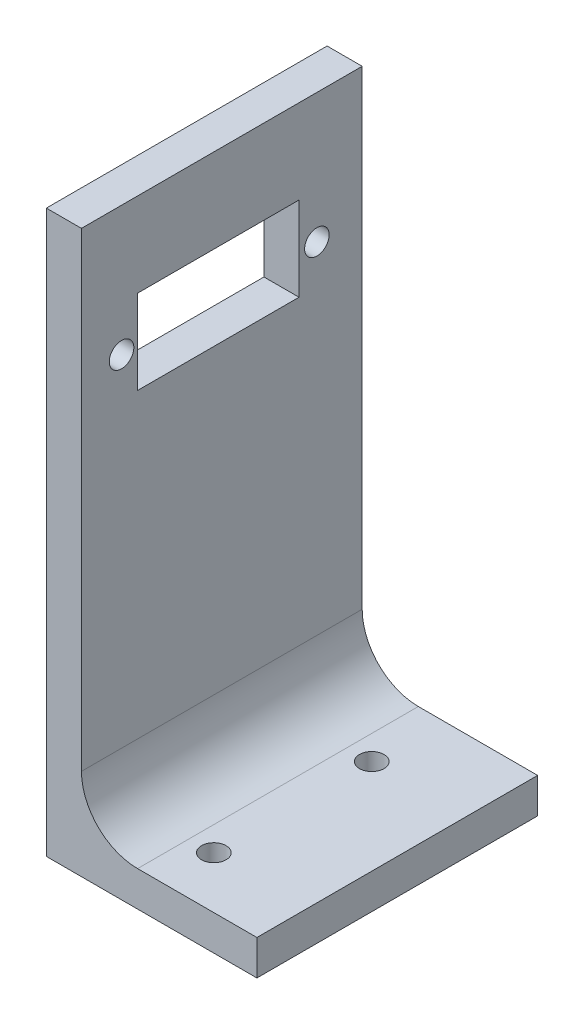
ISO-10303-21;
HEADER;
FILE_DESCRIPTION(('STEP AP214'),'2;1');
FILE_NAME('part.step','',(''),(''),'','','');
FILE_SCHEMA(('AUTOMOTIVE_DESIGN { 1 0 10303 214 1 1 1 1 }'));
ENDSEC;
DATA;
#1=APPLICATION_CONTEXT('core data for automotive mechanical design processes');
#2=APPLICATION_PROTOCOL_DEFINITION('international standard','automotive_design',2000,#1);
#3=PRODUCT_CONTEXT('',#1,'mechanical');
#4=PRODUCT('Part','Part','',(#3));
#5=PRODUCT_RELATED_PRODUCT_CATEGORY('part','',(#4));
#6=PRODUCT_DEFINITION_FORMATION('','',#4);
#7=PRODUCT_DEFINITION_CONTEXT('part definition',#1,'design');
#8=PRODUCT_DEFINITION('design','',#6,#7);
#9=PRODUCT_DEFINITION_SHAPE('','',#8);
#10=(LENGTH_UNIT() NAMED_UNIT(*) SI_UNIT(.MILLI.,.METRE.));
#11=(NAMED_UNIT(*) PLANE_ANGLE_UNIT() SI_UNIT($,.RADIAN.));
#12=(NAMED_UNIT(*) SI_UNIT($,.STERADIAN.) SOLID_ANGLE_UNIT());
#13=UNCERTAINTY_MEASURE_WITH_UNIT(LENGTH_MEASURE(1.E-05),#10,'distance_accuracy_value','');
#14=(GEOMETRIC_REPRESENTATION_CONTEXT(3) GLOBAL_UNCERTAINTY_ASSIGNED_CONTEXT((#13)) GLOBAL_UNIT_ASSIGNED_CONTEXT((#10,
#11,#12)) REPRESENTATION_CONTEXT('',''));
#15=CARTESIAN_POINT('',(0.,0.,0.));
#16=DIRECTION('',(0.,0.,1.));
#17=DIRECTION('',(1.,0.,0.));
#18=AXIS2_PLACEMENT_3D('',#15,#16,#17);
#19=CARTESIAN_POINT('',(0.,-34.9738219895288,40.));
#20=DIRECTION('',(0.,-1.,0.));
#21=DIRECTION('',(0.,0.,-1.));
#22=AXIS2_PLACEMENT_3D('',#19,#20,#21);
#23=PLANE('',#22);
#24=CARTESIAN_POINT('',(-13.5290293124797,-34.9738219895288,32.612904953595));
#25=DIRECTION('',(0.,1.,0.));
#26=DIRECTION('',(0.,0.,1.));
#27=AXIS2_PLACEMENT_3D('',#24,#25,#26);
#28=CIRCLE('',#27,1.74999999999999);
#29=CARTESIAN_POINT('',(-13.5290293124797,-34.9738219895288,34.362904953595));
#30=VERTEX_POINT('',#29);
#31=EDGE_CURVE('E142',#30,#30,#28,.T.);
#32=ORIENTED_EDGE('',*,*,#31,.F.);
#33=EDGE_LOOP('',(#32));
#34=FACE_BOUND('',#33,.T.);
#35=CARTESIAN_POINT('',(-13.5290293124797,-34.9738219895288,10.1107689095841));
#36=DIRECTION('',(0.,1.,0.));
#37=DIRECTION('',(0.,0.,1.));
#38=AXIS2_PLACEMENT_3D('',#35,#36,#37);
#39=CIRCLE('',#38,1.74999999999999);
#40=CARTESIAN_POINT('',(-13.5290293124797,-34.9738219895288,11.8607689095841));
#41=VERTEX_POINT('',#40);
#42=EDGE_CURVE('E150',#41,#41,#39,.T.);
#43=ORIENTED_EDGE('',*,*,#42,.F.);
#44=EDGE_LOOP('',(#43));
#45=FACE_BOUND('',#44,.T.);
#46=DIRECTION('',(-1.,0.,0.));
#47=VECTOR('',#46,1.);
#48=CARTESIAN_POINT('',(0.,-34.9738219895288,0.));
#49=LINE('',#48,#47);
#50=CARTESIAN_POINT('',(0.,-34.9738219895288,0.));
#51=VERTEX_POINT('',#50);
#52=CARTESIAN_POINT('',(-17.,-34.9738219895288,0.));
#53=VERTEX_POINT('',#52);
#54=EDGE_CURVE('E156',#51,#53,#49,.T.);
#55=ORIENTED_EDGE('',*,*,#54,.T.);
#56=DIRECTION('',(0.,0.,-1.));
#57=VECTOR('',#56,1.);
#58=CARTESIAN_POINT('',(-17.,-34.9738219895288,40.));
#59=LINE('',#58,#57);
#60=CARTESIAN_POINT('',(-17.,-34.9738219895288,40.));
#61=VERTEX_POINT('',#60);
#62=EDGE_CURVE('E200',#53,#61,#59,.F.);
#63=ORIENTED_EDGE('',*,*,#62,.T.);
#64=DIRECTION('',(-1.,0.,0.));
#65=VECTOR('',#64,1.);
#66=CARTESIAN_POINT('',(0.,-34.9738219895288,40.));
#67=LINE('',#66,#65);
#68=CARTESIAN_POINT('',(0.,-34.9738219895288,40.));
#69=VERTEX_POINT('',#68);
#70=EDGE_CURVE('E157',#69,#61,#67,.T.);
#71=ORIENTED_EDGE('',*,*,#70,.F.);
#72=DIRECTION('',(0.,0.,-1.));
#73=VECTOR('',#72,1.);
#74=CARTESIAN_POINT('',(0.,-34.9738219895288,40.));
#75=LINE('',#74,#73);
#76=EDGE_CURVE('E171',#69,#51,#75,.T.);
#77=ORIENTED_EDGE('',*,*,#76,.T.);
#78=EDGE_LOOP('',(#55,#63,#71,#77));
#79=FACE_BOUND('',#78,.T.);
#80=ADVANCED_FACE('F33',(#34,#45,#79),#23,.F.);
#81=CARTESIAN_POINT('',(-25.,-34.9738219895288,40.));
#82=DIRECTION('',(-1.,0.,0.));
#83=DIRECTION('',(0.,-1.,0.));
#84=AXIS2_PLACEMENT_3D('',#81,#82,#83);
#85=PLANE('',#84);
#86=CARTESIAN_POINT('',(-25.,21.588594031158,6.45454845479065));
#87=DIRECTION('',(1.,0.,0.));
#88=DIRECTION('',(0.,0.,-1.));
#89=AXIS2_PLACEMENT_3D('',#86,#87,#88);
#90=CIRCLE('',#89,1.74999999999999);
#91=CARTESIAN_POINT('',(-25.,21.588594031158,4.70454845479067));
#92=VERTEX_POINT('',#91);
#93=EDGE_CURVE('E363',#92,#92,#90,.T.);
#94=ORIENTED_EDGE('',*,*,#93,.F.);
#95=EDGE_LOOP('',(#94));
#96=FACE_BOUND('',#95,.T.);
#97=CARTESIAN_POINT('',(-25.,21.588594031158,34.2852899401649));
#98=DIRECTION('',(1.,0.,0.));
#99=DIRECTION('',(0.,0.,-1.));
#100=AXIS2_PLACEMENT_3D('',#97,#98,#99);
#101=CIRCLE('',#100,1.74999999999999);
#102=CARTESIAN_POINT('',(-25.,21.588594031158,32.5352899401649));
#103=VERTEX_POINT('',#102);
#104=EDGE_CURVE('E367',#103,#103,#101,.T.);
#105=ORIENTED_EDGE('',*,*,#104,.F.);
#106=EDGE_LOOP('',(#105));
#107=FACE_BOUND('',#106,.T.);
#108=DIRECTION('',(0.,0.,1.));
#109=VECTOR('',#108,1.);
#110=CARTESIAN_POINT('',(-25.,28.0261780104712,9.));
#111=LINE('',#110,#109);
#112=CARTESIAN_POINT('',(-25.,28.0261780104712,9.));
#113=VERTEX_POINT('',#112);
#114=CARTESIAN_POINT('',(-25.,28.0261780104712,32.));
#115=VERTEX_POINT('',#114);
#116=EDGE_CURVE('E128',#113,#115,#111,.T.);
#117=ORIENTED_EDGE('',*,*,#116,.F.);
#118=DIRECTION('',(0.,1.,0.));
#119=VECTOR('',#118,1.);
#120=CARTESIAN_POINT('',(-25.,28.0261780104712,9.));
#121=LINE('',#120,#119);
#122=CARTESIAN_POINT('',(-25.,16.0261780104712,9.));
#123=VERTEX_POINT('',#122);
#124=EDGE_CURVE('E48',#123,#113,#121,.T.);
#125=ORIENTED_EDGE('',*,*,#124,.F.);
#126=DIRECTION('',(0.,0.,-1.));
#127=VECTOR('',#126,1.);
#128=CARTESIAN_POINT('',(-25.,16.0261780104712,9.));
#129=LINE('',#128,#127);
#130=CARTESIAN_POINT('',(-25.,16.0261780104712,32.));
#131=VERTEX_POINT('',#130);
#132=EDGE_CURVE('E135',#131,#123,#129,.T.);
#133=ORIENTED_EDGE('',*,*,#132,.F.);
#134=DIRECTION('',(0.,-1.,0.));
#135=VECTOR('',#134,1.);
#136=CARTESIAN_POINT('',(-25.,28.0261780104712,32.));
#137=LINE('',#136,#135);
#138=EDGE_CURVE('E119',#115,#131,#137,.T.);
#139=ORIENTED_EDGE('',*,*,#138,.F.);
#140=EDGE_LOOP('',(#117,#125,#133,#139));
#141=FACE_BOUND('',#140,.T.);
#142=DIRECTION('',(0.,1.,0.));
#143=VECTOR('',#142,1.);
#144=CARTESIAN_POINT('',(-25.,-34.9738219895288,40.));
#145=LINE('',#144,#143);
#146=CARTESIAN_POINT('',(-25.,-26.9738219895288,40.));
#147=VERTEX_POINT('',#146);
#148=CARTESIAN_POINT('',(-25.,40.0261780104712,40.));
#149=VERTEX_POINT('',#148);
#150=EDGE_CURVE('E160',#147,#149,#145,.T.);
#151=ORIENTED_EDGE('',*,*,#150,.F.);
#152=DIRECTION('',(0.,0.,-1.));
#153=VECTOR('',#152,1.);
#154=CARTESIAN_POINT('',(-25.,-26.9738219895288,0.));
#155=LINE('',#154,#153);
#156=CARTESIAN_POINT('',(-25.,-26.9738219895288,0.));
#157=VERTEX_POINT('',#156);
#158=EDGE_CURVE('E197',#147,#157,#155,.T.);
#159=ORIENTED_EDGE('',*,*,#158,.T.);
#160=DIRECTION('',(0.,1.,0.));
#161=VECTOR('',#160,1.);
#162=CARTESIAN_POINT('',(-25.,-34.9738219895288,0.));
#163=LINE('',#162,#161);
#164=CARTESIAN_POINT('',(-25.,40.0261780104712,0.));
#165=VERTEX_POINT('',#164);
#166=EDGE_CURVE('E174',#157,#165,#163,.T.);
#167=ORIENTED_EDGE('',*,*,#166,.T.);
#168=DIRECTION('',(0.,0.,-1.));
#169=VECTOR('',#168,1.);
#170=CARTESIAN_POINT('',(-25.,40.0261780104712,40.));
#171=LINE('',#170,#169);
#172=EDGE_CURVE('E194',#149,#165,#171,.T.);
#173=ORIENTED_EDGE('',*,*,#172,.F.);
#174=EDGE_LOOP('',(#151,#159,#167,#173));
#175=FACE_BOUND('',#174,.T.);
#176=ADVANCED_FACE('F132',(#96,#107,#141,#175),#85,.F.);
#177=CARTESIAN_POINT('',(-25.,40.0261780104712,40.));
#178=DIRECTION('',(0.,-1.,0.));
#179=DIRECTION('',(0.,0.,-1.));
#180=AXIS2_PLACEMENT_3D('',#177,#178,#179);
#181=PLANE('',#180);
#182=DIRECTION('',(-1.,0.,0.));
#183=VECTOR('',#182,1.);
#184=CARTESIAN_POINT('',(-25.,40.0261780104712,0.));
#185=LINE('',#184,#183);
#186=CARTESIAN_POINT('',(-30.,40.0261780104712,0.));
#187=VERTEX_POINT('',#186);
#188=EDGE_CURVE('E176',#165,#187,#185,.T.);
#189=ORIENTED_EDGE('',*,*,#188,.T.);
#190=DIRECTION('',(0.,0.,-1.));
#191=VECTOR('',#190,1.);
#192=CARTESIAN_POINT('',(-30.,40.0261780104712,40.));
#193=LINE('',#192,#191);
#194=CARTESIAN_POINT('',(-30.,40.0261780104712,40.));
#195=VERTEX_POINT('',#194);
#196=EDGE_CURVE('E191',#195,#187,#193,.T.);
#197=ORIENTED_EDGE('',*,*,#196,.F.);
#198=DIRECTION('',(-1.,0.,0.));
#199=VECTOR('',#198,1.);
#200=CARTESIAN_POINT('',(-25.,40.0261780104712,40.));
#201=LINE('',#200,#199);
#202=EDGE_CURVE('E163',#149,#195,#201,.T.);
#203=ORIENTED_EDGE('',*,*,#202,.F.);
#204=ORIENTED_EDGE('',*,*,#172,.T.);
#205=EDGE_LOOP('',(#189,#197,#203,#204));
#206=FACE_BOUND('',#205,.T.);
#207=ADVANCED_FACE('F234',(#206),#181,.F.);
#208=CARTESIAN_POINT('',(-30.,40.0261780104712,40.));
#209=DIRECTION('',(1.,0.,0.));
#210=DIRECTION('',(0.,1.,0.));
#211=AXIS2_PLACEMENT_3D('',#208,#209,#210);
#212=PLANE('',#211);
#213=CARTESIAN_POINT('',(-30.,21.588594031158,6.45454845479065));
#214=DIRECTION('',(1.,0.,0.));
#215=DIRECTION('',(0.,1.,0.));
#216=AXIS2_PLACEMENT_3D('',#213,#214,#215);
#217=CIRCLE('',#216,1.74999999999999);
#218=CARTESIAN_POINT('',(-30.,23.338594031158,6.45454845479065));
#219=VERTEX_POINT('',#218);
#220=EDGE_CURVE('E366',#219,#219,#217,.T.);
#221=ORIENTED_EDGE('',*,*,#220,.T.);
#222=EDGE_LOOP('',(#221));
#223=FACE_BOUND('',#222,.T.);
#224=CARTESIAN_POINT('',(-30.,21.588594031158,34.2852899401649));
#225=DIRECTION('',(1.,0.,0.));
#226=DIRECTION('',(0.,1.,0.));
#227=AXIS2_PLACEMENT_3D('',#224,#225,#226);
#228=CIRCLE('',#227,1.74999999999999);
#229=CARTESIAN_POINT('',(-30.,23.338594031158,34.2852899401649));
#230=VERTEX_POINT('',#229);
#231=EDGE_CURVE('E370',#230,#230,#228,.T.);
#232=ORIENTED_EDGE('',*,*,#231,.T.);
#233=EDGE_LOOP('',(#232));
#234=FACE_BOUND('',#233,.T.);
#235=DIRECTION('',(0.,0.,-1.));
#236=VECTOR('',#235,1.);
#237=CARTESIAN_POINT('',(-30.,16.0261780104712,40.));
#238=LINE('',#237,#236);
#239=CARTESIAN_POINT('',(-30.,16.0261780104712,32.));
#240=VERTEX_POINT('',#239);
#241=CARTESIAN_POINT('',(-30.,16.0261780104712,9.));
#242=VERTEX_POINT('',#241);
#243=EDGE_CURVE('E41',#240,#242,#238,.T.);
#244=ORIENTED_EDGE('',*,*,#243,.T.);
#245=DIRECTION('',(0.,1.,0.));
#246=VECTOR('',#245,1.);
#247=CARTESIAN_POINT('',(-30.,40.0261780104712,9.));
#248=LINE('',#247,#246);
#249=CARTESIAN_POINT('',(-30.,28.0261780104712,9.));
#250=VERTEX_POINT('',#249);
#251=EDGE_CURVE('E11',#242,#250,#248,.T.);
#252=ORIENTED_EDGE('',*,*,#251,.T.);
#253=DIRECTION('',(0.,0.,1.));
#254=VECTOR('',#253,1.);
#255=CARTESIAN_POINT('',(-30.,28.0261780104712,40.));
#256=LINE('',#255,#254);
#257=CARTESIAN_POINT('',(-30.,28.0261780104712,32.));
#258=VERTEX_POINT('',#257);
#259=EDGE_CURVE('E206',#250,#258,#256,.T.);
#260=ORIENTED_EDGE('',*,*,#259,.T.);
#261=DIRECTION('',(0.,-1.,0.));
#262=VECTOR('',#261,1.);
#263=CARTESIAN_POINT('',(-30.,40.0261780104712,32.));
#264=LINE('',#263,#262);
#265=EDGE_CURVE('E122',#258,#240,#264,.T.);
#266=ORIENTED_EDGE('',*,*,#265,.T.);
#267=EDGE_LOOP('',(#244,#252,#260,#266));
#268=FACE_BOUND('',#267,.T.);
#269=DIRECTION('',(0.,-1.,0.));
#270=VECTOR('',#269,1.);
#271=CARTESIAN_POINT('',(-30.,40.0261780104712,0.));
#272=LINE('',#271,#270);
#273=CARTESIAN_POINT('',(-30.,-39.9738219895288,0.));
#274=VERTEX_POINT('',#273);
#275=EDGE_CURVE('E178',#187,#274,#272,.T.);
#276=ORIENTED_EDGE('',*,*,#275,.T.);
#277=DIRECTION('',(0.,0.,-1.));
#278=VECTOR('',#277,1.);
#279=CARTESIAN_POINT('',(-30.,-39.9738219895288,40.));
#280=LINE('',#279,#278);
#281=CARTESIAN_POINT('',(-30.,-39.9738219895288,40.));
#282=VERTEX_POINT('',#281);
#283=EDGE_CURVE('E188',#282,#274,#280,.T.);
#284=ORIENTED_EDGE('',*,*,#283,.F.);
#285=DIRECTION('',(0.,-1.,0.));
#286=VECTOR('',#285,1.);
#287=CARTESIAN_POINT('',(-30.,40.0261780104712,40.));
#288=LINE('',#287,#286);
#289=EDGE_CURVE('E165',#195,#282,#288,.T.);
#290=ORIENTED_EDGE('',*,*,#289,.F.);
#291=ORIENTED_EDGE('',*,*,#196,.T.);
#292=EDGE_LOOP('',(#276,#284,#290,#291));
#293=FACE_BOUND('',#292,.T.);
#294=ADVANCED_FACE('F210',(#223,#234,#268,#293),#212,.F.);
#295=CARTESIAN_POINT('',(-30.,-39.9738219895288,40.));
#296=DIRECTION('',(0.,1.,0.));
#297=DIRECTION('',(0.,0.,1.));
#298=AXIS2_PLACEMENT_3D('',#295,#296,#297);
#299=PLANE('',#298);
#300=CARTESIAN_POINT('',(-13.5290293124797,-39.9738219895288,32.612904953595));
#301=DIRECTION('',(0.,1.,0.));
#302=DIRECTION('',(0.,0.,1.));
#303=AXIS2_PLACEMENT_3D('',#300,#301,#302);
#304=CIRCLE('',#303,1.74999999999999);
#305=CARTESIAN_POINT('',(-13.5290293124797,-39.9738219895288,34.362904953595));
#306=VERTEX_POINT('',#305);
#307=EDGE_CURVE('E147',#306,#306,#304,.T.);
#308=ORIENTED_EDGE('',*,*,#307,.T.);
#309=EDGE_LOOP('',(#308));
#310=FACE_BOUND('',#309,.T.);
#311=CARTESIAN_POINT('',(-13.5290293124797,-39.9738219895288,10.1107689095841));
#312=DIRECTION('',(0.,1.,0.));
#313=DIRECTION('',(0.,0.,1.));
#314=AXIS2_PLACEMENT_3D('',#311,#312,#313);
#315=CIRCLE('',#314,1.74999999999999);
#316=CARTESIAN_POINT('',(-13.5290293124797,-39.9738219895288,11.8607689095841));
#317=VERTEX_POINT('',#316);
#318=EDGE_CURVE('E153',#317,#317,#315,.T.);
#319=ORIENTED_EDGE('',*,*,#318,.T.);
#320=EDGE_LOOP('',(#319));
#321=FACE_BOUND('',#320,.T.);
#322=DIRECTION('',(1.,0.,0.));
#323=VECTOR('',#322,1.);
#324=CARTESIAN_POINT('',(-30.,-39.9738219895288,0.));
#325=LINE('',#324,#323);
#326=CARTESIAN_POINT('',(0.,-39.9738219895288,0.));
#327=VERTEX_POINT('',#326);
#328=EDGE_CURVE('E180',#274,#327,#325,.T.);
#329=ORIENTED_EDGE('',*,*,#328,.T.);
#330=DIRECTION('',(0.,0.,-1.));
#331=VECTOR('',#330,1.);
#332=CARTESIAN_POINT('',(0.,-39.9738219895288,40.));
#333=LINE('',#332,#331);
#334=CARTESIAN_POINT('',(0.,-39.9738219895288,40.));
#335=VERTEX_POINT('',#334);
#336=EDGE_CURVE('E185',#335,#327,#333,.T.);
#337=ORIENTED_EDGE('',*,*,#336,.F.);
#338=DIRECTION('',(1.,0.,0.));
#339=VECTOR('',#338,1.);
#340=CARTESIAN_POINT('',(-30.,-39.9738219895288,40.));
#341=LINE('',#340,#339);
#342=EDGE_CURVE('E167',#282,#335,#341,.T.);
#343=ORIENTED_EDGE('',*,*,#342,.F.);
#344=ORIENTED_EDGE('',*,*,#283,.T.);
#345=EDGE_LOOP('',(#329,#337,#343,#344));
#346=FACE_BOUND('',#345,.T.);
#347=ADVANCED_FACE('F245',(#310,#321,#346),#299,.F.);
#348=CARTESIAN_POINT('',(0.,-39.9738219895288,40.));
#349=DIRECTION('',(-1.,0.,0.));
#350=DIRECTION('',(0.,0.,1.));
#351=AXIS2_PLACEMENT_3D('',#348,#349,#350);
#352=PLANE('',#351);
#353=DIRECTION('',(0.,1.,0.));
#354=VECTOR('',#353,1.);
#355=CARTESIAN_POINT('',(0.,-39.9738219895288,0.));
#356=LINE('',#355,#354);
#357=EDGE_CURVE('E161',#327,#51,#356,.T.);
#358=ORIENTED_EDGE('',*,*,#357,.T.);
#359=ORIENTED_EDGE('',*,*,#76,.F.);
#360=DIRECTION('',(0.,1.,0.));
#361=VECTOR('',#360,1.);
#362=CARTESIAN_POINT('',(0.,-39.9738219895288,40.));
#363=LINE('',#362,#361);
#364=EDGE_CURVE('E169',#335,#69,#363,.T.);
#365=ORIENTED_EDGE('',*,*,#364,.F.);
#366=ORIENTED_EDGE('',*,*,#336,.T.);
#367=EDGE_LOOP('',(#358,#359,#365,#366));
#368=FACE_BOUND('',#367,.T.);
#369=ADVANCED_FACE('F249',(#368),#352,.F.);
#370=CARTESIAN_POINT('',(0.,0.,40.));
#371=DIRECTION('',(0.,0.,-1.));
#372=DIRECTION('',(-1.,0.,0.));
#373=AXIS2_PLACEMENT_3D('',#370,#371,#372);
#374=PLANE('',#373);
#375=ORIENTED_EDGE('',*,*,#70,.T.);
#376=CARTESIAN_POINT('',(-17.,-26.9738219895288,40.));
#377=DIRECTION('',(0.,0.,-1.));
#378=DIRECTION('',(-1.,0.,0.));
#379=AXIS2_PLACEMENT_3D('',#376,#377,#378);
#380=CIRCLE('',#379,8.);
#381=EDGE_CURVE('E204',#61,#147,#380,.T.);
#382=ORIENTED_EDGE('',*,*,#381,.T.);
#383=ORIENTED_EDGE('',*,*,#150,.T.);
#384=ORIENTED_EDGE('',*,*,#202,.T.);
#385=ORIENTED_EDGE('',*,*,#289,.T.);
#386=ORIENTED_EDGE('',*,*,#342,.T.);
#387=ORIENTED_EDGE('',*,*,#364,.T.);
#388=EDGE_LOOP('',(#375,#382,#383,#384,#385,#386,#387));
#389=FACE_BOUND('',#388,.T.);
#390=ADVANCED_FACE('F253',(#389),#374,.F.);
#391=CARTESIAN_POINT('',(0.,0.,0.));
#392=DIRECTION('',(0.,0.,-1.));
#393=DIRECTION('',(-1.,0.,0.));
#394=AXIS2_PLACEMENT_3D('',#391,#392,#393);
#395=PLANE('',#394);
#396=ORIENTED_EDGE('',*,*,#54,.F.);
#397=ORIENTED_EDGE('',*,*,#357,.F.);
#398=ORIENTED_EDGE('',*,*,#328,.F.);
#399=ORIENTED_EDGE('',*,*,#275,.F.);
#400=ORIENTED_EDGE('',*,*,#188,.F.);
#401=ORIENTED_EDGE('',*,*,#166,.F.);
#402=CARTESIAN_POINT('',(-17.,-26.9738219895288,0.));
#403=DIRECTION('',(0.,0.,-1.));
#404=DIRECTION('',(-1.,0.,0.));
#405=AXIS2_PLACEMENT_3D('',#402,#403,#404);
#406=CIRCLE('',#405,8.);
#407=EDGE_CURVE('E202',#157,#53,#406,.F.);
#408=ORIENTED_EDGE('',*,*,#407,.T.);
#409=EDGE_LOOP('',(#396,#397,#398,#399,#400,#401,#408));
#410=FACE_BOUND('',#409,.T.);
#411=ADVANCED_FACE('F255',(#410),#395,.T.);
#412=CARTESIAN_POINT('',(-13.5290293124797,-34.9738219895288,10.1107689095841));
#413=DIRECTION('',(0.,1.,0.));
#414=DIRECTION('',(0.,0.,1.));
#415=AXIS2_PLACEMENT_3D('',#412,#413,#414);
#416=CYLINDRICAL_SURFACE('',#415,1.74999999999999);
#417=ORIENTED_EDGE('',*,*,#42,.T.);
#418=EDGE_LOOP('',(#417));
#419=FACE_BOUND('',#418,.T.);
#420=ORIENTED_EDGE('',*,*,#318,.F.);
#421=EDGE_LOOP('',(#420));
#422=FACE_BOUND('',#421,.T.);
#423=ADVANCED_FACE('F258',(#419,#422),#416,.F.);
#424=CARTESIAN_POINT('',(-13.5290293124797,-34.9738219895288,32.612904953595));
#425=DIRECTION('',(0.,1.,0.));
#426=DIRECTION('',(0.,0.,1.));
#427=AXIS2_PLACEMENT_3D('',#424,#425,#426);
#428=CYLINDRICAL_SURFACE('',#427,1.74999999999999);
#429=ORIENTED_EDGE('',*,*,#31,.T.);
#430=EDGE_LOOP('',(#429));
#431=FACE_BOUND('',#430,.T.);
#432=ORIENTED_EDGE('',*,*,#307,.F.);
#433=EDGE_LOOP('',(#432));
#434=FACE_BOUND('',#433,.T.);
#435=ADVANCED_FACE('F223',(#431,#434),#428,.F.);
#436=CARTESIAN_POINT('',(-17.,-26.9738219895288,40.));
#437=DIRECTION('',(0.,0.,1.));
#438=DIRECTION('',(1.,0.,0.));
#439=AXIS2_PLACEMENT_3D('',#436,#437,#438);
#440=CYLINDRICAL_SURFACE('',#439,8.);
#441=ORIENTED_EDGE('',*,*,#381,.F.);
#442=ORIENTED_EDGE('',*,*,#62,.F.);
#443=ORIENTED_EDGE('',*,*,#407,.F.);
#444=ORIENTED_EDGE('',*,*,#158,.F.);
#445=EDGE_LOOP('',(#441,#442,#443,#444));
#446=FACE_BOUND('',#445,.T.);
#447=ADVANCED_FACE('F35',(#446),#440,.F.);
#448=CARTESIAN_POINT('',(-35.,28.0261780104712,9.));
#449=DIRECTION('',(0.,0.,-1.));
#450=DIRECTION('',(0.,1.,0.));
#451=AXIS2_PLACEMENT_3D('',#448,#449,#450);
#452=PLANE('',#451);
#453=DIRECTION('',(1.,0.,0.));
#454=VECTOR('',#453,1.);
#455=CARTESIAN_POINT('',(-35.,16.0261780104712,9.));
#456=LINE('',#455,#454);
#457=EDGE_CURVE('E140',#242,#123,#456,.T.);
#458=ORIENTED_EDGE('',*,*,#457,.T.);
#459=ORIENTED_EDGE('',*,*,#124,.T.);
#460=DIRECTION('',(1.,0.,0.));
#461=VECTOR('',#460,1.);
#462=CARTESIAN_POINT('',(-35.,28.0261780104712,9.));
#463=LINE('',#462,#461);
#464=EDGE_CURVE('E125',#250,#113,#463,.T.);
#465=ORIENTED_EDGE('',*,*,#464,.F.);
#466=ORIENTED_EDGE('',*,*,#251,.F.);
#467=EDGE_LOOP('',(#458,#459,#465,#466));
#468=FACE_BOUND('',#467,.T.);
#469=ADVANCED_FACE('F215',(#468),#452,.F.);
#470=CARTESIAN_POINT('',(-35.,16.0261780104712,9.));
#471=DIRECTION('',(0.,-1.,0.));
#472=DIRECTION('',(0.,0.,-1.));
#473=AXIS2_PLACEMENT_3D('',#470,#471,#472);
#474=PLANE('',#473);
#475=DIRECTION('',(1.,0.,0.));
#476=VECTOR('',#475,1.);
#477=CARTESIAN_POINT('',(-35.,16.0261780104712,32.));
#478=LINE('',#477,#476);
#479=EDGE_CURVE('E124',#240,#131,#478,.T.);
#480=ORIENTED_EDGE('',*,*,#479,.T.);
#481=ORIENTED_EDGE('',*,*,#132,.T.);
#482=ORIENTED_EDGE('',*,*,#457,.F.);
#483=ORIENTED_EDGE('',*,*,#243,.F.);
#484=EDGE_LOOP('',(#480,#481,#482,#483));
#485=FACE_BOUND('',#484,.T.);
#486=ADVANCED_FACE('F214',(#485),#474,.F.);
#487=CARTESIAN_POINT('',(-35.,28.0261780104712,32.));
#488=DIRECTION('',(0.,0.,1.));
#489=DIRECTION('',(1.,0.,0.));
#490=AXIS2_PLACEMENT_3D('',#487,#488,#489);
#491=PLANE('',#490);
#492=DIRECTION('',(1.,0.,0.));
#493=VECTOR('',#492,1.);
#494=CARTESIAN_POINT('',(-35.,28.0261780104712,32.));
#495=LINE('',#494,#493);
#496=EDGE_CURVE('E56',#258,#115,#495,.T.);
#497=ORIENTED_EDGE('',*,*,#496,.T.);
#498=ORIENTED_EDGE('',*,*,#138,.T.);
#499=ORIENTED_EDGE('',*,*,#479,.F.);
#500=ORIENTED_EDGE('',*,*,#265,.F.);
#501=EDGE_LOOP('',(#497,#498,#499,#500));
#502=FACE_BOUND('',#501,.T.);
#503=ADVANCED_FACE('F116',(#502),#491,.F.);
#504=CARTESIAN_POINT('',(-35.,28.0261780104712,9.));
#505=DIRECTION('',(0.,1.,0.));
#506=DIRECTION('',(0.,0.,1.));
#507=AXIS2_PLACEMENT_3D('',#504,#505,#506);
#508=PLANE('',#507);
#509=ORIENTED_EDGE('',*,*,#464,.T.);
#510=ORIENTED_EDGE('',*,*,#116,.T.);
#511=ORIENTED_EDGE('',*,*,#496,.F.);
#512=ORIENTED_EDGE('',*,*,#259,.F.);
#513=EDGE_LOOP('',(#509,#510,#511,#512));
#514=FACE_BOUND('',#513,.T.);
#515=ADVANCED_FACE('F129',(#514),#508,.F.);
#516=CARTESIAN_POINT('',(-25.,21.588594031158,34.2852899401649));
#517=DIRECTION('',(1.,0.,0.));
#518=DIRECTION('',(0.,0.,-1.));
#519=AXIS2_PLACEMENT_3D('',#516,#517,#518);
#520=CYLINDRICAL_SURFACE('',#519,1.74999999999999);
#521=ORIENTED_EDGE('',*,*,#104,.T.);
#522=EDGE_LOOP('',(#521));
#523=FACE_BOUND('',#522,.T.);
#524=ORIENTED_EDGE('',*,*,#231,.F.);
#525=EDGE_LOOP('',(#524));
#526=FACE_BOUND('',#525,.T.);
#527=ADVANCED_FACE('F328',(#523,#526),#520,.F.);
#528=CARTESIAN_POINT('',(-25.,21.588594031158,6.45454845479065));
#529=DIRECTION('',(1.,0.,0.));
#530=DIRECTION('',(0.,0.,-1.));
#531=AXIS2_PLACEMENT_3D('',#528,#529,#530);
#532=CYLINDRICAL_SURFACE('',#531,1.74999999999999);
#533=ORIENTED_EDGE('',*,*,#93,.T.);
#534=EDGE_LOOP('',(#533));
#535=FACE_BOUND('',#534,.T.);
#536=ORIENTED_EDGE('',*,*,#220,.F.);
#537=EDGE_LOOP('',(#536));
#538=FACE_BOUND('',#537,.T.);
#539=ADVANCED_FACE('F346',(#535,#538),#532,.F.);
#540=CLOSED_SHELL('',(#80,#176,#207,#294,#347,#369,#390,#411,#423,#435,#447,#469,#486,#503,#515,
#527,#539));
#541=MANIFOLD_SOLID_BREP('B2',#540);
#542=ADVANCED_BREP_SHAPE_REPRESENTATION('',(#18,#541),#14);
#543=SHAPE_DEFINITION_REPRESENTATION(#9,#542);
ENDSEC;
END-ISO-10303-21;
